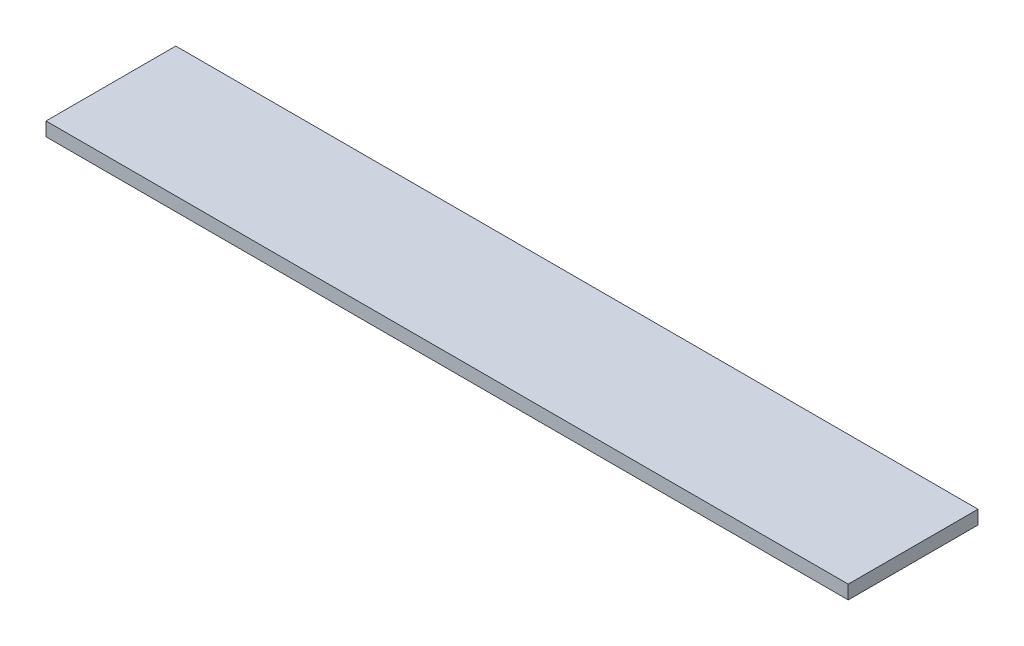
ISO-10303-21;
HEADER;
FILE_DESCRIPTION(('STEP AP214'),'2;1');
FILE_NAME('part.step','',(''),(''),'','','');
FILE_SCHEMA(('AUTOMOTIVE_DESIGN { 1 0 10303 214 1 1 1 1 }'));
ENDSEC;
DATA;
#1=APPLICATION_CONTEXT('core data for automotive mechanical design processes');
#2=APPLICATION_PROTOCOL_DEFINITION('international standard','automotive_design',2000,#1);
#3=PRODUCT_CONTEXT('',#1,'mechanical');
#4=PRODUCT('Part','Part','',(#3));
#5=PRODUCT_RELATED_PRODUCT_CATEGORY('part','',(#4));
#6=PRODUCT_DEFINITION_FORMATION('','',#4);
#7=PRODUCT_DEFINITION_CONTEXT('part definition',#1,'design');
#8=PRODUCT_DEFINITION('design','',#6,#7);
#9=PRODUCT_DEFINITION_SHAPE('','',#8);
#10=(LENGTH_UNIT() NAMED_UNIT(*) SI_UNIT(.MILLI.,.METRE.));
#11=(NAMED_UNIT(*) PLANE_ANGLE_UNIT() SI_UNIT($,.RADIAN.));
#12=(NAMED_UNIT(*) SI_UNIT($,.STERADIAN.) SOLID_ANGLE_UNIT());
#13=UNCERTAINTY_MEASURE_WITH_UNIT(LENGTH_MEASURE(1.E-05),#10,'distance_accuracy_value','');
#14=(GEOMETRIC_REPRESENTATION_CONTEXT(3) GLOBAL_UNCERTAINTY_ASSIGNED_CONTEXT((#13)) GLOBAL_UNIT_ASSIGNED_CONTEXT((#10,
#11,#12)) REPRESENTATION_CONTEXT('',''));
#15=CARTESIAN_POINT('',(0.,0.,0.));
#16=DIRECTION('',(0.,0.,1.));
#17=DIRECTION('',(1.,0.,0.));
#18=AXIS2_PLACEMENT_3D('',#15,#16,#17);
#19=CARTESIAN_POINT('',(0.,4.65,0.));
#20=DIRECTION('',(1.,0.,0.));
#21=DIRECTION('',(0.,0.,-1.));
#22=AXIS2_PLACEMENT_3D('',#19,#20,#21);
#23=PLANE('',#22);
#24=DIRECTION('',(0.,0.,1.));
#25=VECTOR('',#24,1.);
#26=CARTESIAN_POINT('',(0.,0.,0.));
#27=LINE('',#26,#25);
#28=CARTESIAN_POINT('',(0.,0.,-44.));
#29=VERTEX_POINT('',#28);
#30=CARTESIAN_POINT('',(0.,0.,0.));
#31=VERTEX_POINT('',#30);
#32=EDGE_CURVE('E96',#29,#31,#27,.T.);
#33=ORIENTED_EDGE('',*,*,#32,.T.);
#34=DIRECTION('',(0.,-1.,0.));
#35=VECTOR('',#34,1.);
#36=CARTESIAN_POINT('',(0.,4.65,0.));
#37=LINE('',#36,#35);
#38=CARTESIAN_POINT('',(0.,4.65,0.));
#39=VERTEX_POINT('',#38);
#40=EDGE_CURVE('E11',#39,#31,#37,.T.);
#41=ORIENTED_EDGE('',*,*,#40,.F.);
#42=DIRECTION('',(0.,0.,1.));
#43=VECTOR('',#42,1.);
#44=CARTESIAN_POINT('',(0.,4.65,0.));
#45=LINE('',#44,#43);
#46=CARTESIAN_POINT('',(0.,4.65,-44.));
#47=VERTEX_POINT('',#46);
#48=EDGE_CURVE('E84',#47,#39,#45,.T.);
#49=ORIENTED_EDGE('',*,*,#48,.F.);
#50=DIRECTION('',(0.,-1.,0.));
#51=VECTOR('',#50,1.);
#52=CARTESIAN_POINT('',(0.,4.65,-44.));
#53=LINE('',#52,#51);
#54=EDGE_CURVE('E92',#47,#29,#53,.T.);
#55=ORIENTED_EDGE('',*,*,#54,.T.);
#56=EDGE_LOOP('',(#33,#41,#49,#55));
#57=FACE_BOUND('',#56,.T.);
#58=ADVANCED_FACE('F33',(#57),#23,.F.);
#59=CARTESIAN_POINT('',(0.,4.65,0.));
#60=DIRECTION('',(0.,0.,-1.));
#61=DIRECTION('',(-1.,0.,0.));
#62=AXIS2_PLACEMENT_3D('',#59,#60,#61);
#63=PLANE('',#62);
#64=DIRECTION('',(1.,0.,0.));
#65=VECTOR('',#64,1.);
#66=CARTESIAN_POINT('',(0.,0.,0.));
#67=LINE('',#66,#65);
#68=CARTESIAN_POINT('',(272.,0.,0.));
#69=VERTEX_POINT('',#68);
#70=EDGE_CURVE('E88',#31,#69,#67,.T.);
#71=ORIENTED_EDGE('',*,*,#70,.T.);
#72=DIRECTION('',(0.,-1.,0.));
#73=VECTOR('',#72,1.);
#74=CARTESIAN_POINT('',(272.,4.65,0.));
#75=LINE('',#74,#73);
#76=CARTESIAN_POINT('',(272.,4.65,0.));
#77=VERTEX_POINT('',#76);
#78=EDGE_CURVE('E41',#77,#69,#75,.T.);
#79=ORIENTED_EDGE('',*,*,#78,.F.);
#80=DIRECTION('',(1.,0.,0.));
#81=VECTOR('',#80,1.);
#82=CARTESIAN_POINT('',(0.,4.65,0.));
#83=LINE('',#82,#81);
#84=EDGE_CURVE('E79',#39,#77,#83,.T.);
#85=ORIENTED_EDGE('',*,*,#84,.F.);
#86=ORIENTED_EDGE('',*,*,#40,.T.);
#87=EDGE_LOOP('',(#71,#79,#85,#86));
#88=FACE_BOUND('',#87,.T.);
#89=ADVANCED_FACE('F87',(#88),#63,.F.);
#90=CARTESIAN_POINT('',(272.,4.65,0.));
#91=DIRECTION('',(-1.,0.,0.));
#92=DIRECTION('',(0.,0.,1.));
#93=AXIS2_PLACEMENT_3D('',#90,#91,#92);
#94=PLANE('',#93);
#95=DIRECTION('',(0.,0.,-1.));
#96=VECTOR('',#95,1.);
#97=CARTESIAN_POINT('',(272.,0.,0.));
#98=LINE('',#97,#96);
#99=CARTESIAN_POINT('',(272.,0.,-44.));
#100=VERTEX_POINT('',#99);
#101=EDGE_CURVE('E66',#69,#100,#98,.T.);
#102=ORIENTED_EDGE('',*,*,#101,.T.);
#103=DIRECTION('',(0.,-1.,0.));
#104=VECTOR('',#103,1.);
#105=CARTESIAN_POINT('',(272.,4.65,-44.));
#106=LINE('',#105,#104);
#107=CARTESIAN_POINT('',(272.,4.65,-44.));
#108=VERTEX_POINT('',#107);
#109=EDGE_CURVE('E89',#108,#100,#106,.T.);
#110=ORIENTED_EDGE('',*,*,#109,.F.);
#111=DIRECTION('',(0.,0.,-1.));
#112=VECTOR('',#111,1.);
#113=CARTESIAN_POINT('',(272.,4.65,0.));
#114=LINE('',#113,#112);
#115=EDGE_CURVE('E82',#77,#108,#114,.T.);
#116=ORIENTED_EDGE('',*,*,#115,.F.);
#117=ORIENTED_EDGE('',*,*,#78,.T.);
#118=EDGE_LOOP('',(#102,#110,#116,#117));
#119=FACE_BOUND('',#118,.T.);
#120=ADVANCED_FACE('F90',(#119),#94,.F.);
#121=CARTESIAN_POINT('',(0.,4.65,-44.));
#122=DIRECTION('',(0.,0.,1.));
#123=DIRECTION('',(1.,0.,0.));
#124=AXIS2_PLACEMENT_3D('',#121,#122,#123);
#125=PLANE('',#124);
#126=DIRECTION('',(-1.,0.,0.));
#127=VECTOR('',#126,1.);
#128=CARTESIAN_POINT('',(0.,0.,-44.));
#129=LINE('',#128,#127);
#130=EDGE_CURVE('E72',#100,#29,#129,.T.);
#131=ORIENTED_EDGE('',*,*,#130,.T.);
#132=ORIENTED_EDGE('',*,*,#54,.F.);
#133=DIRECTION('',(-1.,0.,0.));
#134=VECTOR('',#133,1.);
#135=CARTESIAN_POINT('',(0.,4.65,-44.));
#136=LINE('',#135,#134);
#137=EDGE_CURVE('E49',#108,#47,#136,.T.);
#138=ORIENTED_EDGE('',*,*,#137,.F.);
#139=ORIENTED_EDGE('',*,*,#109,.T.);
#140=EDGE_LOOP('',(#131,#132,#138,#139));
#141=FACE_BOUND('',#140,.T.);
#142=ADVANCED_FACE('F103',(#141),#125,.F.);
#143=CARTESIAN_POINT('',(0.,4.65,0.));
#144=DIRECTION('',(0.,-1.,0.));
#145=DIRECTION('',(0.,0.,-1.));
#146=AXIS2_PLACEMENT_3D('',#143,#144,#145);
#147=PLANE('',#146);
#148=ORIENTED_EDGE('',*,*,#48,.T.);
#149=ORIENTED_EDGE('',*,*,#84,.T.);
#150=ORIENTED_EDGE('',*,*,#115,.T.);
#151=ORIENTED_EDGE('',*,*,#137,.T.);
#152=EDGE_LOOP('',(#148,#149,#150,#151));
#153=FACE_BOUND('',#152,.T.);
#154=ADVANCED_FACE('F80',(#153),#147,.F.);
#155=CARTESIAN_POINT('',(0.,0.,0.));
#156=DIRECTION('',(0.,-1.,0.));
#157=DIRECTION('',(0.,0.,-1.));
#158=AXIS2_PLACEMENT_3D('',#155,#156,#157);
#159=PLANE('',#158);
#160=ORIENTED_EDGE('',*,*,#32,.F.);
#161=ORIENTED_EDGE('',*,*,#130,.F.);
#162=ORIENTED_EDGE('',*,*,#101,.F.);
#163=ORIENTED_EDGE('',*,*,#70,.F.);
#164=EDGE_LOOP('',(#160,#161,#162,#163));
#165=FACE_BOUND('',#164,.T.);
#166=ADVANCED_FACE('F106',(#165),#159,.T.);
#167=CLOSED_SHELL('',(#58,#89,#120,#142,#154,#166));
#168=MANIFOLD_SOLID_BREP('B2',#167);
#169=ADVANCED_BREP_SHAPE_REPRESENTATION('',(#18,#168),#14);
#170=SHAPE_DEFINITION_REPRESENTATION(#9,#169);
ENDSEC;
END-ISO-10303-21;
